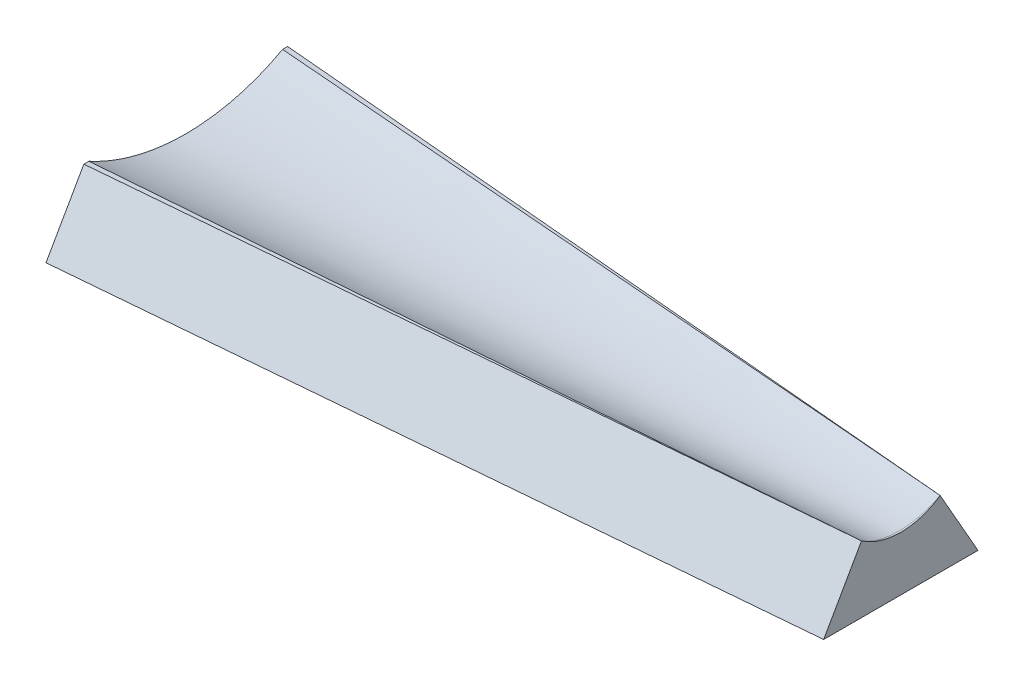
ISO-10303-21;
HEADER;
FILE_DESCRIPTION(('STEP AP214'),'2;1');
FILE_NAME('part.step','',(''),(''),'','','');
FILE_SCHEMA(('AUTOMOTIVE_DESIGN { 1 0 10303 214 1 1 1 1 }'));
ENDSEC;
DATA;
#1=APPLICATION_CONTEXT('core data for automotive mechanical design processes');
#2=APPLICATION_PROTOCOL_DEFINITION('international standard','automotive_design',2000,#1);
#3=PRODUCT_CONTEXT('',#1,'mechanical');
#4=PRODUCT('Part','Part','',(#3));
#5=PRODUCT_RELATED_PRODUCT_CATEGORY('part','',(#4));
#6=PRODUCT_DEFINITION_FORMATION('','',#4);
#7=PRODUCT_DEFINITION_CONTEXT('part definition',#1,'design');
#8=PRODUCT_DEFINITION('design','',#6,#7);
#9=PRODUCT_DEFINITION_SHAPE('','',#8);
#10=(LENGTH_UNIT() NAMED_UNIT(*) SI_UNIT(.MILLI.,.METRE.));
#11=(NAMED_UNIT(*) PLANE_ANGLE_UNIT() SI_UNIT($,.RADIAN.));
#12=(NAMED_UNIT(*) SI_UNIT($,.STERADIAN.) SOLID_ANGLE_UNIT());
#13=UNCERTAINTY_MEASURE_WITH_UNIT(LENGTH_MEASURE(1.E-05),#10,'distance_accuracy_value','');
#14=(GEOMETRIC_REPRESENTATION_CONTEXT(3) GLOBAL_UNCERTAINTY_ASSIGNED_CONTEXT((#13)) GLOBAL_UNIT_ASSIGNED_CONTEXT((#10,
#11,#12)) REPRESENTATION_CONTEXT('',''));
#15=CARTESIAN_POINT('',(0.,0.,0.));
#16=DIRECTION('',(0.,0.,1.));
#17=DIRECTION('',(1.,0.,0.));
#18=AXIS2_PLACEMENT_3D('',#15,#16,#17);
#19=CARTESIAN_POINT('',(0.,0.,0.));
#20=DIRECTION('',(0.,1.,0.));
#21=DIRECTION('',(0.,0.,1.));
#22=AXIS2_PLACEMENT_3D('',#19,#20,#21);
#23=PLANE('',#22);
#24=CARTESIAN_POINT('',(-481.101714589346,0.,-94.4301169260983));
#25=CARTESIAN_POINT('',(-460.793139446602,0.,-92.8315989057633));
#26=CARTESIAN_POINT('',(-440.484579057395,0.,-91.232893404631));
#27=CARTESIAN_POINT('',(-399.867498098951,0.,-88.0349759662863));
#28=CARTESIAN_POINT('',(-379.558977529714,0.,-86.4357640290724));
#29=CARTESIAN_POINT('',(-338.941938040032,0.,-83.2366984253851));
#30=CARTESIAN_POINT('',(-318.633419119706,0.,-81.6368447573854));
#31=CARTESIAN_POINT('',(-278.016447243401,0.,-78.4363007554237));
#32=CARTESIAN_POINT('',(-257.707994287422,0.,-76.8356104214632));
#33=CARTESIAN_POINT('',(-216.472729682998,0.,-73.5843454175446));
#34=CARTESIAN_POINT('',(-195.545920768954,0.,-71.9337360651106));
#35=CARTESIAN_POINT('',(-153.692434457314,0.,-68.6308508627134));
#36=CARTESIAN_POINT('',(-132.765757059717,0.,-66.9785750127517));
#37=CARTESIAN_POINT('',(-90.9126445403119,0.,-63.6715883698086));
#38=CARTESIAN_POINT('',(-69.9862094180462,0.,-62.016877582608));
#39=CARTESIAN_POINT('',(-28.1336361280555,0.,-58.7037072709059));
#40=CARTESIAN_POINT('',(-7.20749796032594,0.,-57.0452477464607));
#41=CARTESIAN_POINT('',(28.9103343320269,0.,-54.1773433520797));
#42=CARTESIAN_POINT('',(44.102146389927,0.,-52.9693845070351));
#43=CARTESIAN_POINT('',(66.8895941805889,0.,-51.153523756822));
#44=CARTESIAN_POINT('',(74.485386041492,0.,-50.5475814138793));
#45=CARTESIAN_POINT('',(89.6768342093184,0.,-49.3340040692662));
#46=CARTESIAN_POINT('',(97.272490516248,0.,-48.726369067675));
#47=CARTESIAN_POINT('',(113.38849988728,0.,-47.4347672857676));
#48=CARTESIAN_POINT('',(121.908830098435,0.,-46.7505151913928));
#49=CARTESIAN_POINT('',(138.949178412372,0.,-45.3781124875566));
#50=CARTESIAN_POINT('',(147.469196515089,0.,-44.6899618772962));
#51=CARTESIAN_POINT('',(164.508623696231,0.,-43.3079955947986));
#52=CARTESIAN_POINT('',(173.028032782716,0.,-42.6141800221295));
#53=CARTESIAN_POINT('',(185.806595801582,0.,-41.5667598488501));
#54=CARTESIAN_POINT('',(190.066024102239,0.,-41.2165037331824));
#55=CARTESIAN_POINT('',(198.584640437587,0.,-40.5130831547855));
#56=CARTESIAN_POINT('',(202.843828472293,0.,-40.1599186922437));
#57=CARTESIAN_POINT('',(211.362168368881,0.,-39.449739670929));
#58=CARTESIAN_POINT('',(215.621320209633,0.,-39.0927248583867));
#59=CARTESIAN_POINT('',(224.139186658414,0.,-38.3734707509594));
#60=CARTESIAN_POINT('',(228.397901266082,0.,-38.0112314517912));
#61=CARTESIAN_POINT('',(236.914925937638,0.,-37.2793586417331));
#62=CARTESIAN_POINT('',(241.173235967946,0.,-36.9097247384587));
#63=CARTESIAN_POINT('',(247.55996129023,0.,-36.346901099442));
#64=CARTESIAN_POINT('',(249.688745324041,0.,-36.1578978573888));
#65=CARTESIAN_POINT('',(253.945994562012,0.,-35.7763360494246));
#66=CARTESIAN_POINT('',(256.074459766288,0.,-35.5837774848086));
#67=CARTESIAN_POINT('',(260.331761737513,0.,-35.1940028137257));
#68=CARTESIAN_POINT('',(262.460598348671,0.,-34.9967850032913));
#69=CARTESIAN_POINT('',(266.717697426414,0.,-34.5962529776883));
#70=CARTESIAN_POINT('',(268.845959893901,0.,-34.392938772164));
#71=CARTESIAN_POINT('',(272.037615425979,0.,-34.0815982570127));
#72=CARTESIAN_POINT('',(273.101319676466,0.,-33.9767624325004));
#73=CARTESIAN_POINT('',(275.228470824327,0.,-33.7645143443449));
#74=CARTESIAN_POINT('',(276.291917721884,0.,-33.6571020825216));
#75=CARTESIAN_POINT('',(278.418495102641,0.,-33.4391302530269));
#76=CARTESIAN_POINT('',(279.481625584165,0.,-33.328570668969));
#77=CARTESIAN_POINT('',(281.607470156558,0.,-33.1035212944989));
#78=CARTESIAN_POINT('',(282.67018424807,0.,-32.9890315101848));
#79=CARTESIAN_POINT('',(284.79621276737,0.,-32.7548799323516));
#80=CARTESIAN_POINT('',(285.859526592567,0.,-32.6352126536145));
#81=CARTESIAN_POINT('',(287.985360922718,0.,-32.3891876683227));
#82=CARTESIAN_POINT('',(289.047881446144,0.,-32.2628301227965));
#83=CARTESIAN_POINT('',(290.640879235957,0.,-32.066241448047));
#84=CARTESIAN_POINT('',(291.171790730819,0.,-31.9995308397285));
#85=CARTESIAN_POINT('',(292.233242301183,0.,-31.8632411927003));
#86=CARTESIAN_POINT('',(292.763782379464,0.,-31.7936621756911));
#87=CARTESIAN_POINT('',(293.824427678002,0.,-31.6509554440546));
#88=CARTESIAN_POINT('',(294.354532863239,0.,-31.5778274676418));
#89=CARTESIAN_POINT('',(295.149214217731,0.,-31.4647391944719));
#90=CARTESIAN_POINT('',(295.414032015864,0.,-31.4264765358723));
#91=CARTESIAN_POINT('',(295.943476741122,0.,-31.3486423889029));
#92=CARTESIAN_POINT('',(296.208103667044,0.,-31.3090708923525));
#93=CARTESIAN_POINT('',(296.472618614066,0.,-31.2687567178504));
#94=B_SPLINE_CURVE_WITH_KNOTS('',3,(#24,#25,#26,#27,#28,#29,#30,#31,#32,#33,#34,#35,#36,#37,#38,
#39,#40,#41,#42,#43,#44,#45,#46,#47,#48,#49,#50,#51,#52,#53,#54,#55,#56,#57,#58,#59,#60,#61,#62,
#63,#64,#65,#66,#67,#68,#69,#70,#71,#72,#73,#74,#75,#76,#77,#78,#79,#80,#81,#82,#83,#84,#85,#86,
#87,#88,#89,#90,#91,#92,#93),.UNSPECIFIED.,.F.,.F.,(4,2,2,2,2,2,2,2,2,2,2,2,2,2,2,2,2,2,2,2,2,2,
2,2,2,2,2,2,2,2,2,2,2,2,4),(0.,61.1141665918438,122.2283333451,183.342646323869,
244.456959183974,307.432371666988,370.407784086336,433.383047232684,496.358309434538,
542.077592052653,564.937359644493,587.797126166822,613.440410197012,639.083699482504,
664.726539024516,677.547953153256,690.36936645624,703.19163002289,716.013904102125,
728.836860392042,735.248331790882,741.65980085429,748.07365215642,754.487493312511,
757.69406471348,760.90063384943,764.107219683351,767.313800542165,770.523865991427,
773.733854212532,775.339106934623,776.944347514702,778.549706684267,779.352407003982,
780.155112341763),.UNSPECIFIED.);
#95=CARTESIAN_POINT('',(203.2,1.66533453693773E-13,-40.1296964284681));
#96=VERTEX_POINT('',#95);
#97=CARTESIAN_POINT('',(0.,-1.17961196366423E-13,-56.4724956722654));
#98=VERTEX_POINT('',#97);
#99=EDGE_CURVE('E91',#96,#98,#94,.F.);
#100=ORIENTED_EDGE('',*,*,#99,.F.);
#101=DIRECTION('',(-0.996194698091745,0.,-0.0871557427476585));
#102=VECTOR('',#101,1.);
#103=CARTESIAN_POINT('',(203.2,0.,-40.1296964284678));
#104=LINE('',#103,#102);
#105=CARTESIAN_POINT('',(0.,0.,-57.9073928569356));
#106=VERTEX_POINT('',#105);
#107=EDGE_CURVE('E101',#96,#106,#104,.T.);
#108=ORIENTED_EDGE('',*,*,#107,.T.);
#109=DIRECTION('',(0.,0.,1.));
#110=VECTOR('',#109,1.);
#111=CARTESIAN_POINT('',(0.,0.,-57.9073928569356));
#112=LINE('',#111,#110);
#113=EDGE_CURVE('E102',#106,#98,#112,.T.);
#114=ORIENTED_EDGE('',*,*,#113,.T.);
#115=EDGE_LOOP('',(#100,#108,#114));
#116=FACE_BOUND('',#115,.T.);
#117=ADVANCED_FACE('F36',(#116),#23,.T.);
#118=CARTESIAN_POINT('',(203.2,0.,-69.6934460270554));
#119=DIRECTION('',(1.,0.,0.));
#120=DIRECTION('',(0.,0.,-1.));
#121=AXIS2_PLACEMENT_3D('',#118,#119,#120);
#122=PLANE('',#121);
#123=DIRECTION('',(0.,-0.869116984205263,-0.494606578773422));
#124=VECTOR('',#123,1.);
#125=CARTESIAN_POINT('',(203.2,0.,-40.1296964284678));
#126=LINE('',#125,#124);
#127=CARTESIAN_POINT('',(203.2,-18.8961086529955,-50.8833001697815));
#128=VERTEX_POINT('',#127);
#129=EDGE_CURVE('E107',#96,#128,#126,.T.);
#130=ORIENTED_EDGE('',*,*,#129,.F.);
#131=CARTESIAN_POINT('',(203.2,16.6600398950166,-28.9536964284678));
#132=DIRECTION('',(1.,0.,0.));
#133=DIRECTION('',(0.,1.,0.));
#134=AXIS2_PLACEMENT_3D('',#131,#132,#133);
#135=ELLIPSE('',#134,20.1508908632652,19.8667391960805);
#136=CARTESIAN_POINT('',(203.2,0.,-17.7776964284678));
#137=VERTEX_POINT('',#136);
#138=EDGE_CURVE('E12',#96,#137,#135,.F.);
#139=ORIENTED_EDGE('',*,*,#138,.T.);
#140=DIRECTION('',(0.,0.869116984205263,-0.494606578773422));
#141=VECTOR('',#140,1.);
#142=CARTESIAN_POINT('',(203.2,-7.64211575227725,-13.4286377913493));
#143=LINE('',#142,#141);
#144=CARTESIAN_POINT('',(203.2,-18.8961086529955,-7.02409268715417));
#145=VERTEX_POINT('',#144);
#146=EDGE_CURVE('E113',#145,#137,#143,.T.);
#147=ORIENTED_EDGE('',*,*,#146,.F.);
#148=DIRECTION('',(0.,0.,1.));
#149=VECTOR('',#148,1.);
#150=CARTESIAN_POINT('',(203.2,-18.8961086529955,-69.6934460270554));
#151=LINE('',#150,#149);
#152=EDGE_CURVE('E109',#128,#145,#151,.T.);
#153=ORIENTED_EDGE('',*,*,#152,.F.);
#154=EDGE_LOOP('',(#130,#139,#147,#153));
#155=FACE_BOUND('',#154,.T.);
#156=ADVANCED_FACE('F108',(#155),#122,.T.);
#157=CARTESIAN_POINT('',(203.2,0.,-40.1296964284678));
#158=DIRECTION('',(0.075819015635063,0.493182901133967,-0.866615314252647));
#159=DIRECTION('',(0.,0.869116984205263,0.494606578773422));
#160=AXIS2_PLACEMENT_3D('',#157,#158,#159);
#161=PLANE('',#160);
#162=DIRECTION('',(-0.996194698091746,0.,-0.0871557427476585));
#163=VECTOR('',#162,1.);
#164=CARTESIAN_POINT('',(204.133671846516,-18.8961086529955,-50.801614467758));
#165=LINE('',#164,#163);
#166=CARTESIAN_POINT('',(0.,-18.8961086529955,-68.6609965982493));
#167=VERTEX_POINT('',#166);
#168=EDGE_CURVE('E122',#128,#167,#165,.T.);
#169=ORIENTED_EDGE('',*,*,#168,.T.);
#170=DIRECTION('',(0.,0.869116984205263,0.494606578773422));
#171=VECTOR('',#170,1.);
#172=CARTESIAN_POINT('',(0.,7.64211575227725,-53.5583342198171));
#173=LINE('',#172,#171);
#174=EDGE_CURVE('E57',#167,#106,#173,.T.);
#175=ORIENTED_EDGE('',*,*,#174,.T.);
#176=ORIENTED_EDGE('',*,*,#107,.F.);
#177=ORIENTED_EDGE('',*,*,#129,.T.);
#178=EDGE_LOOP('',(#169,#175,#176,#177));
#179=FACE_BOUND('',#178,.T.);
#180=ADVANCED_FACE('F38',(#179),#161,.T.);
#181=CARTESIAN_POINT('',(0.,0.,0.));
#182=DIRECTION('',(0.075819015635063,0.493182901133967,0.866615314252647));
#183=DIRECTION('',(0.,-0.869116984205263,0.494606578773422));
#184=AXIS2_PLACEMENT_3D('',#181,#182,#183);
#185=PLANE('',#184);
#186=DIRECTION('',(0.996194698091745,0.,-0.0871557427476585));
#187=VECTOR('',#186,1.);
#188=CARTESIAN_POINT('',(0.,0.,0.));
#189=LINE('',#188,#187);
#190=CARTESIAN_POINT('',(0.,0.,0.));
#191=VERTEX_POINT('',#190);
#192=EDGE_CURVE('E115',#191,#137,#189,.T.);
#193=ORIENTED_EDGE('',*,*,#192,.F.);
#194=DIRECTION('',(0.,-0.869116984205263,0.494606578773422));
#195=VECTOR('',#194,1.);
#196=CARTESIAN_POINT('',(0.,0.,0.));
#197=LINE('',#196,#195);
#198=CARTESIAN_POINT('',(0.,-18.8961086529955,10.7536037413137));
#199=VERTEX_POINT('',#198);
#200=EDGE_CURVE('E112',#191,#199,#197,.T.);
#201=ORIENTED_EDGE('',*,*,#200,.T.);
#202=DIRECTION('',(0.996194698091746,0.,-0.0871557427476585));
#203=VECTOR('',#202,1.);
#204=CARTESIAN_POINT('',(0.933671846515704,-18.8961086529955,10.6719180392902));
#205=LINE('',#204,#203);
#206=EDGE_CURVE('E44',#199,#145,#205,.T.);
#207=ORIENTED_EDGE('',*,*,#206,.T.);
#208=ORIENTED_EDGE('',*,*,#146,.T.);
#209=EDGE_LOOP('',(#193,#201,#207,#208));
#210=FACE_BOUND('',#209,.T.);
#211=ADVANCED_FACE('F147',(#210),#185,.T.);
#212=CARTESIAN_POINT('',(-481.101714589346,0.,36.5227240691626));
#213=CARTESIAN_POINT('',(-460.793139446602,0.,34.9242060488277));
#214=CARTESIAN_POINT('',(-440.484579057395,0.,33.3255005476954));
#215=CARTESIAN_POINT('',(-399.867498098951,0.,30.1275831093506));
#216=CARTESIAN_POINT('',(-379.558977529714,0.,28.5283711721367));
#217=CARTESIAN_POINT('',(-338.941938040032,0.,25.3293055684495));
#218=CARTESIAN_POINT('',(-318.633419119706,0.,23.7294519004498));
#219=CARTESIAN_POINT('',(-278.016447243401,0.,20.528907898488));
#220=CARTESIAN_POINT('',(-257.707994287422,0.,18.9282175645275));
#221=CARTESIAN_POINT('',(-216.472729682998,0.,15.6769525606089));
#222=CARTESIAN_POINT('',(-195.545920768954,0.,14.026343208175));
#223=CARTESIAN_POINT('',(-153.692434457314,0.,10.7234580057777));
#224=CARTESIAN_POINT('',(-132.765757059717,0.,9.0711821558161));
#225=CARTESIAN_POINT('',(-90.9126445403119,0.,5.76419551287294));
#226=CARTESIAN_POINT('',(-69.9862094180462,0.,4.10948472567233));
#227=CARTESIAN_POINT('',(-28.1336361280555,0.,0.79631441397029));
#228=CARTESIAN_POINT('',(-7.20749796032595,0.,-0.862145110474921));
#229=CARTESIAN_POINT('',(28.9103343320269,0.,-3.73004950485592));
#230=CARTESIAN_POINT('',(44.102146389927,0.,-4.93800834990049));
#231=CARTESIAN_POINT('',(66.8895941805889,0.,-6.75386910011365));
#232=CARTESIAN_POINT('',(74.485386041492,0.,-7.35981144305635));
#233=CARTESIAN_POINT('',(89.6768342093184,0.,-8.57338878766942));
#234=CARTESIAN_POINT('',(97.272490516248,0.,-9.18102378926061));
#235=CARTESIAN_POINT('',(113.38849988728,0.,-10.472625571168));
#236=CARTESIAN_POINT('',(121.908830098435,0.,-11.1568776655428));
#237=CARTESIAN_POINT('',(138.949178412372,0.,-12.529280369379));
#238=CARTESIAN_POINT('',(147.469196515089,0.,-13.2174309796394));
#239=CARTESIAN_POINT('',(164.508623696231,0.,-14.599397262137));
#240=CARTESIAN_POINT('',(173.028032782716,0.,-15.2932128348062));
#241=CARTESIAN_POINT('',(185.806595801582,0.,-16.3406330080855));
#242=CARTESIAN_POINT('',(190.066024102239,0.,-16.6908891237533));
#243=CARTESIAN_POINT('',(198.584640437587,0.,-17.3943097021501));
#244=CARTESIAN_POINT('',(202.843828472293,0.,-17.747474164692));
#245=CARTESIAN_POINT('',(211.362168368881,0.,-18.4576531860066));
#246=CARTESIAN_POINT('',(215.621320209633,0.,-18.814667998549));
#247=CARTESIAN_POINT('',(224.139186658414,0.,-19.5339221059763));
#248=CARTESIAN_POINT('',(228.397901266083,0.,-19.8961614051444));
#249=CARTESIAN_POINT('',(236.914925937638,0.,-20.6280342152025));
#250=CARTESIAN_POINT('',(241.173235967946,0.,-20.997668118477));
#251=CARTESIAN_POINT('',(247.55996129023,0.,-21.5604917574937));
#252=CARTESIAN_POINT('',(249.688745324041,0.,-21.7494949995468));
#253=CARTESIAN_POINT('',(253.945994562012,0.,-22.131056807511));
#254=CARTESIAN_POINT('',(256.074459766288,0.,-22.3236153721271));
#255=CARTESIAN_POINT('',(260.331761737513,0.,-22.71339004321));
#256=CARTESIAN_POINT('',(262.460598348672,0.,-22.9106078536443));
#257=CARTESIAN_POINT('',(266.717697426414,0.,-23.3111398792474));
#258=CARTESIAN_POINT('',(268.845959893901,0.,-23.5144540847717));
#259=CARTESIAN_POINT('',(272.037615425979,0.,-23.825794599923));
#260=CARTESIAN_POINT('',(273.101319676466,0.,-23.9306304244352));
#261=CARTESIAN_POINT('',(275.228470824327,0.,-24.1428785125907));
#262=CARTESIAN_POINT('',(276.291917721884,0.,-24.250290774414));
#263=CARTESIAN_POINT('',(278.418495102641,0.,-24.4682626039087));
#264=CARTESIAN_POINT('',(279.481625584165,0.,-24.5788221879666));
#265=CARTESIAN_POINT('',(281.607470156558,0.,-24.8038715624367));
#266=CARTESIAN_POINT('',(282.67018424807,0.,-24.9183613467508));
#267=CARTESIAN_POINT('',(284.79621276737,0.,-25.1525129245841));
#268=CARTESIAN_POINT('',(285.859526592567,0.,-25.2721802033212));
#269=CARTESIAN_POINT('',(287.985360922719,0.,-25.5182051886129));
#270=CARTESIAN_POINT('',(289.047881446144,0.,-25.6445627341392));
#271=CARTESIAN_POINT('',(290.640879235957,0.,-25.8411514088887));
#272=CARTESIAN_POINT('',(291.17179073082,0.,-25.9078620172072));
#273=CARTESIAN_POINT('',(292.233242301183,0.,-26.0441516642353));
#274=CARTESIAN_POINT('',(292.763782379464,0.,-26.1137306812445));
#275=CARTESIAN_POINT('',(293.824427678002,0.,-26.256437412881));
#276=CARTESIAN_POINT('',(294.354532863239,0.,-26.3295653892939));
#277=CARTESIAN_POINT('',(295.149214217731,0.,-26.4426536624638));
#278=CARTESIAN_POINT('',(295.414032015864,0.,-26.4809163210633));
#279=CARTESIAN_POINT('',(295.943476741122,0.,-26.5587504680327));
#280=CARTESIAN_POINT('',(296.208103667044,0.,-26.5983219645831));
#281=CARTESIAN_POINT('',(296.472618614066,0.,-26.6386361390853));
#282=B_SPLINE_CURVE_WITH_KNOTS('',3,(#212,#213,#214,#215,#216,#217,#218,#219,#220,#221,#222,
#223,#224,#225,#226,#227,#228,#229,#230,#231,#232,#233,#234,#235,#236,#237,#238,#239,#240,#241,
#242,#243,#244,#245,#246,#247,#248,#249,#250,#251,#252,#253,#254,#255,#256,#257,#258,#259,#260,
#261,#262,#263,#264,#265,#266,#267,#268,#269,#270,#271,#272,#273,#274,#275,#276,#277,#278,#279,
#280,#281),.UNSPECIFIED.,.F.,.F.,(4,2,2,2,2,2,2,2,2,2,2,2,2,2,2,2,2,2,2,2,2,2,2,2,2,2,2,2,2,2,2,
2,2,2,4),(0.,61.1141665918438,122.2283333451,183.342646323869,244.456959183974,307.432371666988,
370.407784086336,433.383047232684,496.358309434538,542.077592052653,564.937359644493,
587.797126166822,613.440410197012,639.083699482504,664.726539024516,677.547953153255,
690.369366456239,703.19163002289,716.013904102125,728.836860392042,735.248331790882,
741.65980085429,748.07365215642,754.487493312511,757.69406471348,760.90063384943,
764.107219683351,767.313800542165,770.523865991428,773.733854212532,775.339106934623,
776.944347514702,778.549706684267,779.352407003982,780.155112341763),.UNSPECIFIED.);
#283=CARTESIAN_POINT('',(0.,-1.17961196366423E-13,-1.43489718467019));
#284=VERTEX_POINT('',#283);
#285=EDGE_CURVE('E94',#284,#137,#282,.T.);
#286=ORIENTED_EDGE('',*,*,#285,.F.);
#287=EDGE_CURVE('E121',#284,#191,#112,.T.);
#288=ORIENTED_EDGE('',*,*,#287,.T.);
#289=ORIENTED_EDGE('',*,*,#192,.T.);
#290=EDGE_LOOP('',(#286,#288,#289));
#291=FACE_BOUND('',#290,.T.);
#292=ADVANCED_FACE('F142',(#291),#23,.T.);
#293=CARTESIAN_POINT('',(0.,0.,-69.6934460270554));
#294=DIRECTION('',(-1.,0.,0.));
#295=DIRECTION('',(0.,0.,1.));
#296=AXIS2_PLACEMENT_3D('',#293,#294,#295);
#297=PLANE('',#296);
#298=CARTESIAN_POINT('',(0.,51.928282977361,-28.9536964284678));
#299=DIRECTION('',(-1.,0.,0.));
#300=DIRECTION('',(0.,1.,0.));
#301=AXIS2_PLACEMENT_3D('',#298,#299,#300);
#302=ELLIPSE('',#301,58.9558064467528,58.1192892764476);
#303=EDGE_CURVE('E95',#98,#284,#302,.T.);
#304=ORIENTED_EDGE('',*,*,#303,.F.);
#305=ORIENTED_EDGE('',*,*,#113,.F.);
#306=ORIENTED_EDGE('',*,*,#174,.F.);
#307=DIRECTION('',(0.,0.,1.));
#308=VECTOR('',#307,1.);
#309=CARTESIAN_POINT('',(0.,-18.8961086529955,-69.6934460270554));
#310=LINE('',#309,#308);
#311=EDGE_CURVE('E103',#167,#199,#310,.T.);
#312=ORIENTED_EDGE('',*,*,#311,.T.);
#313=ORIENTED_EDGE('',*,*,#200,.F.);
#314=ORIENTED_EDGE('',*,*,#287,.F.);
#315=EDGE_LOOP('',(#304,#305,#306,#312,#313,#314));
#316=FACE_BOUND('',#315,.T.);
#317=ADVANCED_FACE('F146',(#316),#297,.T.);
#318=CARTESIAN_POINT('',(0.,-18.8961086529955,-69.6934460270554));
#319=DIRECTION('',(0.,-1.,0.));
#320=DIRECTION('',(0.,0.,-1.));
#321=AXIS2_PLACEMENT_3D('',#318,#319,#320);
#322=PLANE('',#321);
#323=ORIENTED_EDGE('',*,*,#152,.T.);
#324=ORIENTED_EDGE('',*,*,#206,.F.);
#325=ORIENTED_EDGE('',*,*,#311,.F.);
#326=ORIENTED_EDGE('',*,*,#168,.F.);
#327=EDGE_LOOP('',(#323,#324,#325,#326));
#328=FACE_BOUND('',#327,.T.);
#329=ADVANCED_FACE('F163',(#328),#322,.T.);
#330=CARTESIAN_POINT('',(205.820130743038,15.6572839244035,-28.9536964284678));
#331=DIRECTION('',(-0.986285601537231,0.165047605860678,0.));
#332=DIRECTION('',(0.165047605860678,0.986285601537231,0.));
#333=AXIS2_PLACEMENT_3D('',#330,#331,#332);
#334=CONICAL_SURFACE('',#333,19.4143915948968,0.183259571459405);
#335=ORIENTED_EDGE('',*,*,#99,.T.);
#336=ORIENTED_EDGE('',*,*,#303,.T.);
#337=ORIENTED_EDGE('',*,*,#285,.T.);
#338=CARTESIAN_POINT('',(205.820130743038,15.6572839244035,-28.9536964284678));
#339=DIRECTION('',(0.986285601537231,-0.165047605860678,0.));
#340=DIRECTION('',(0.165047605860678,0.986285601537231,0.));
#341=AXIS2_PLACEMENT_3D('',#338,#339,#340);
#342=CIRCLE('',#341,19.4143915948968);
#343=EDGE_CURVE('E83',#137,#96,#342,.T.);
#344=ORIENTED_EDGE('',*,*,#343,.T.);
#345=EDGE_LOOP('',(#335,#336,#337,#344));
#346=FACE_BOUND('',#345,.T.);
#347=ADVANCED_FACE('F90',(#346),#334,.F.);
#348=CARTESIAN_POINT('',(205.820130743038,15.6572839244035,-28.9536964284678));
#349=DIRECTION('',(-0.986285601537231,0.165047605860678,0.));
#350=DIRECTION('',(0.165047605860678,0.986285601537231,0.));
#351=AXIS2_PLACEMENT_3D('',#348,#349,#350);
#352=CONICAL_SURFACE('',#351,19.4143915948968,0.165806278939462);
#353=ORIENTED_EDGE('',*,*,#343,.F.);
#354=ORIENTED_EDGE('',*,*,#138,.F.);
#355=EDGE_LOOP('',(#353,#354));
#356=FACE_BOUND('',#355,.T.);
#357=ADVANCED_FACE('F82',(#356),#352,.F.);
#358=CLOSED_SHELL('',(#117,#156,#180,#211,#292,#317,#329,#347,#357));
#359=MANIFOLD_SOLID_BREP('B2',#358);
#360=ADVANCED_BREP_SHAPE_REPRESENTATION('',(#18,#359),#14);
#361=SHAPE_DEFINITION_REPRESENTATION(#9,#360);
ENDSEC;
END-ISO-10303-21;
